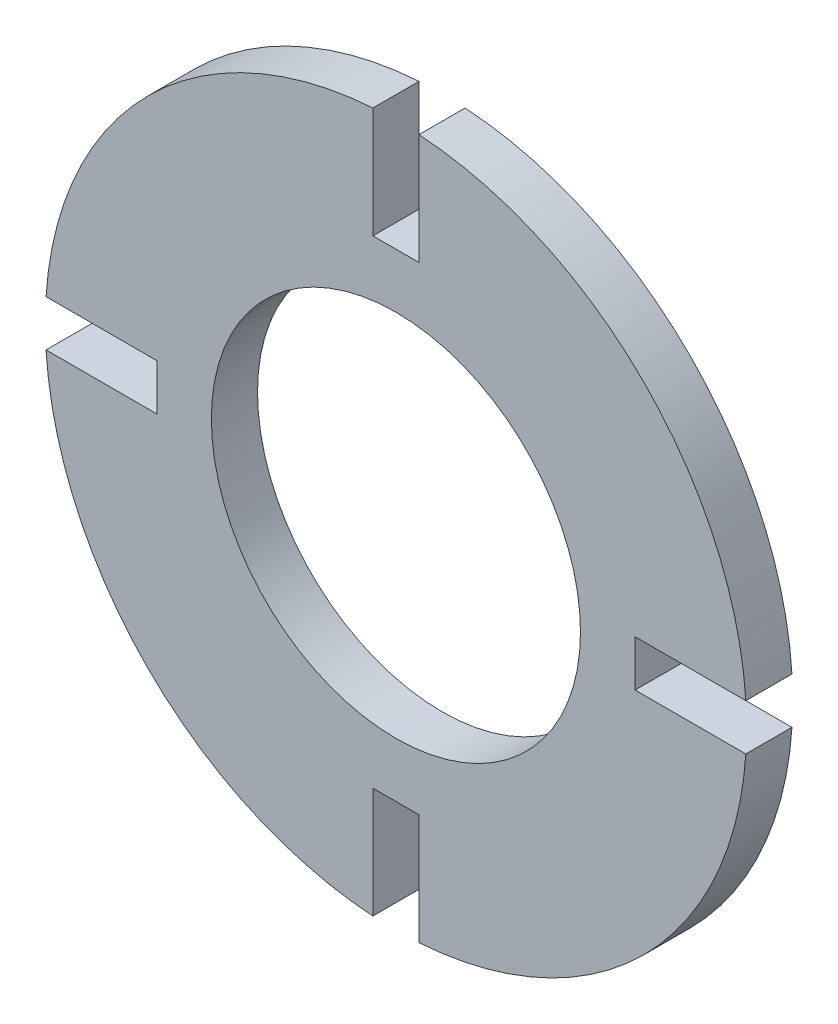
ISO-10303-21;
HEADER;
FILE_DESCRIPTION(('STEP AP214'),'2;1');
FILE_NAME('part.step','',(''),(''),'','','');
FILE_SCHEMA(('AUTOMOTIVE_DESIGN { 1 0 10303 214 1 1 1 1 }'));
ENDSEC;
DATA;
#1=APPLICATION_CONTEXT('core data for automotive mechanical design processes');
#2=APPLICATION_PROTOCOL_DEFINITION('international standard','automotive_design',2000,#1);
#3=PRODUCT_CONTEXT('',#1,'mechanical');
#4=PRODUCT('Part','Part','',(#3));
#5=PRODUCT_RELATED_PRODUCT_CATEGORY('part','',(#4));
#6=PRODUCT_DEFINITION_FORMATION('','',#4);
#7=PRODUCT_DEFINITION_CONTEXT('part definition',#1,'design');
#8=PRODUCT_DEFINITION('design','',#6,#7);
#9=PRODUCT_DEFINITION_SHAPE('','',#8);
#10=(LENGTH_UNIT() NAMED_UNIT(*) SI_UNIT(.MILLI.,.METRE.));
#11=(NAMED_UNIT(*) PLANE_ANGLE_UNIT() SI_UNIT($,.RADIAN.));
#12=(NAMED_UNIT(*) SI_UNIT($,.STERADIAN.) SOLID_ANGLE_UNIT());
#13=UNCERTAINTY_MEASURE_WITH_UNIT(LENGTH_MEASURE(1.E-05),#10,'distance_accuracy_value','');
#14=(GEOMETRIC_REPRESENTATION_CONTEXT(3) GLOBAL_UNCERTAINTY_ASSIGNED_CONTEXT((#13)) GLOBAL_UNIT_ASSIGNED_CONTEXT((#10,
#11,#12)) REPRESENTATION_CONTEXT('',''));
#15=CARTESIAN_POINT('',(0.,0.,0.));
#16=DIRECTION('',(0.,0.,1.));
#17=DIRECTION('',(1.,0.,0.));
#18=AXIS2_PLACEMENT_3D('',#15,#16,#17);
#19=CARTESIAN_POINT('',(0.,0.,5.));
#20=DIRECTION('',(0.,0.,1.));
#21=DIRECTION('',(1.,0.,0.));
#22=AXIS2_PLACEMENT_3D('',#19,#20,#21);
#23=PLANE('',#22);
#24=DIRECTION('',(-1.,0.,0.));
#25=VECTOR('',#24,1.);
#26=CARTESIAN_POINT('',(2.5,25.9176739792936,5.));
#27=LINE('',#26,#25);
#28=CARTESIAN_POINT('',(2.5,25.9176739792936,5.));
#29=VERTEX_POINT('',#28);
#30=CARTESIAN_POINT('',(-2.5,25.9176739792936,5.));
#31=VERTEX_POINT('',#30);
#32=EDGE_CURVE('E215',#29,#31,#27,.T.);
#33=ORIENTED_EDGE('',*,*,#32,.T.);
#34=DIRECTION('',(0.,1.,0.));
#35=VECTOR('',#34,1.);
#36=CARTESIAN_POINT('',(-2.5,25.9176739792936,5.));
#37=LINE('',#36,#35);
#38=CARTESIAN_POINT('',(-2.5,37.9176739792936,5.));
#39=VERTEX_POINT('',#38);
#40=EDGE_CURVE('E123',#31,#39,#37,.T.);
#41=ORIENTED_EDGE('',*,*,#40,.T.);
#42=CARTESIAN_POINT('',(0.,0.,5.));
#43=DIRECTION('',(0.,0.,1.));
#44=DIRECTION('',(1.,0.,0.));
#45=AXIS2_PLACEMENT_3D('',#42,#43,#44);
#46=CIRCLE('',#45,38.);
#47=CARTESIAN_POINT('',(-37.9176739792936,2.49999999999999,5.));
#48=VERTEX_POINT('',#47);
#49=EDGE_CURVE('E254',#39,#48,#46,.T.);
#50=ORIENTED_EDGE('',*,*,#49,.T.);
#51=DIRECTION('',(1.,0.,0.));
#52=VECTOR('',#51,1.);
#53=CARTESIAN_POINT('',(-37.9176739792936,2.49999999999999,5.));
#54=LINE('',#53,#52);
#55=CARTESIAN_POINT('',(-25.9176739792936,2.5,5.));
#56=VERTEX_POINT('',#55);
#57=EDGE_CURVE('E273',#48,#56,#54,.T.);
#58=ORIENTED_EDGE('',*,*,#57,.T.);
#59=DIRECTION('',(0.,-1.,0.));
#60=VECTOR('',#59,1.);
#61=CARTESIAN_POINT('',(-25.9176739792936,2.5,5.));
#62=LINE('',#61,#60);
#63=CARTESIAN_POINT('',(-25.9176739792936,-2.5,5.));
#64=VERTEX_POINT('',#63);
#65=EDGE_CURVE('E270',#56,#64,#62,.T.);
#66=ORIENTED_EDGE('',*,*,#65,.T.);
#67=DIRECTION('',(-1.,0.,0.));
#68=VECTOR('',#67,1.);
#69=CARTESIAN_POINT('',(-25.9176739792936,-2.5,5.));
#70=LINE('',#69,#68);
#71=CARTESIAN_POINT('',(-37.9176739792936,-2.5,5.));
#72=VERTEX_POINT('',#71);
#73=EDGE_CURVE('E272',#64,#72,#70,.T.);
#74=ORIENTED_EDGE('',*,*,#73,.T.);
#75=CARTESIAN_POINT('',(0.,0.,5.));
#76=DIRECTION('',(0.,0.,1.));
#77=DIRECTION('',(1.,0.,0.));
#78=AXIS2_PLACEMENT_3D('',#75,#76,#77);
#79=CIRCLE('',#78,38.);
#80=CARTESIAN_POINT('',(-2.5,-37.9176739792936,5.));
#81=VERTEX_POINT('',#80);
#82=EDGE_CURVE('E275',#72,#81,#79,.T.);
#83=ORIENTED_EDGE('',*,*,#82,.T.);
#84=DIRECTION('',(0.,1.,0.));
#85=VECTOR('',#84,1.);
#86=CARTESIAN_POINT('',(-2.5,-37.9176739792936,5.));
#87=LINE('',#86,#85);
#88=CARTESIAN_POINT('',(-2.5,-25.9176739792936,5.));
#89=VERTEX_POINT('',#88);
#90=EDGE_CURVE('E281',#81,#89,#87,.T.);
#91=ORIENTED_EDGE('',*,*,#90,.T.);
#92=DIRECTION('',(1.,0.,0.));
#93=VECTOR('',#92,1.);
#94=CARTESIAN_POINT('',(-2.5,-25.9176739792936,5.));
#95=LINE('',#94,#93);
#96=CARTESIAN_POINT('',(2.5,-25.9176739792936,5.));
#97=VERTEX_POINT('',#96);
#98=EDGE_CURVE('E283',#89,#97,#95,.T.);
#99=ORIENTED_EDGE('',*,*,#98,.T.);
#100=DIRECTION('',(0.,-1.,0.));
#101=VECTOR('',#100,1.);
#102=CARTESIAN_POINT('',(2.5,-25.9176739792936,5.));
#103=LINE('',#102,#101);
#104=CARTESIAN_POINT('',(2.5,-37.9176739792936,5.));
#105=VERTEX_POINT('',#104);
#106=EDGE_CURVE('E285',#97,#105,#103,.T.);
#107=ORIENTED_EDGE('',*,*,#106,.T.);
#108=CARTESIAN_POINT('',(0.,0.,5.));
#109=DIRECTION('',(0.,0.,1.));
#110=DIRECTION('',(1.,0.,0.));
#111=AXIS2_PLACEMENT_3D('',#108,#109,#110);
#112=CIRCLE('',#111,38.);
#113=CARTESIAN_POINT('',(37.9176739792936,-2.5,5.));
#114=VERTEX_POINT('',#113);
#115=EDGE_CURVE('E287',#105,#114,#112,.T.);
#116=ORIENTED_EDGE('',*,*,#115,.T.);
#117=DIRECTION('',(-1.,0.,0.));
#118=VECTOR('',#117,1.);
#119=CARTESIAN_POINT('',(37.9176739792936,-2.5,5.));
#120=LINE('',#119,#118);
#121=CARTESIAN_POINT('',(25.9176739792936,-2.5,5.));
#122=VERTEX_POINT('',#121);
#123=EDGE_CURVE('E289',#114,#122,#120,.T.);
#124=ORIENTED_EDGE('',*,*,#123,.T.);
#125=DIRECTION('',(0.,1.,0.));
#126=VECTOR('',#125,1.);
#127=CARTESIAN_POINT('',(25.9176739792936,-2.5,5.));
#128=LINE('',#127,#126);
#129=CARTESIAN_POINT('',(25.9176739792936,2.5,5.));
#130=VERTEX_POINT('',#129);
#131=EDGE_CURVE('E166',#122,#130,#128,.T.);
#132=ORIENTED_EDGE('',*,*,#131,.T.);
#133=DIRECTION('',(1.,0.,0.));
#134=VECTOR('',#133,1.);
#135=CARTESIAN_POINT('',(25.9176739792936,2.5,5.));
#136=LINE('',#135,#134);
#137=CARTESIAN_POINT('',(37.9176739792936,2.5,5.));
#138=VERTEX_POINT('',#137);
#139=EDGE_CURVE('E160',#130,#138,#136,.T.);
#140=ORIENTED_EDGE('',*,*,#139,.T.);
#141=CARTESIAN_POINT('',(0.,0.,5.));
#142=DIRECTION('',(0.,0.,1.));
#143=DIRECTION('',(1.,0.,0.));
#144=AXIS2_PLACEMENT_3D('',#141,#142,#143);
#145=CIRCLE('',#144,38.);
#146=CARTESIAN_POINT('',(2.5,37.9176739792936,5.));
#147=VERTEX_POINT('',#146);
#148=EDGE_CURVE('E164',#138,#147,#145,.T.);
#149=ORIENTED_EDGE('',*,*,#148,.T.);
#150=DIRECTION('',(0.,-1.,0.));
#151=VECTOR('',#150,1.);
#152=CARTESIAN_POINT('',(2.5,37.9176739792936,5.));
#153=LINE('',#152,#151);
#154=EDGE_CURVE('E56',#147,#29,#153,.T.);
#155=ORIENTED_EDGE('',*,*,#154,.T.);
#156=EDGE_LOOP('',(#33,#41,#50,#58,#66,#74,#83,#91,#99,#107,#116,#124,#132,#140,#149,#155));
#157=FACE_BOUND('',#156,.T.);
#158=CARTESIAN_POINT('',(0.,0.,5.));
#159=DIRECTION('',(0.,0.,1.));
#160=DIRECTION('',(1.,0.,0.));
#161=AXIS2_PLACEMENT_3D('',#158,#159,#160);
#162=CIRCLE('',#161,20.);
#163=CARTESIAN_POINT('',(20.,0.,5.));
#164=VERTEX_POINT('',#163);
#165=EDGE_CURVE('E188',#164,#164,#162,.T.);
#166=ORIENTED_EDGE('',*,*,#165,.F.);
#167=EDGE_LOOP('',(#166));
#168=FACE_BOUND('',#167,.T.);
#169=ADVANCED_FACE('F39',(#157,#168),#23,.T.);
#170=CARTESIAN_POINT('',(0.,0.,0.));
#171=DIRECTION('',(0.,0.,1.));
#172=DIRECTION('',(1.,0.,0.));
#173=AXIS2_PLACEMENT_3D('',#170,#171,#172);
#174=PLANE('',#173);
#175=DIRECTION('',(-1.,0.,0.));
#176=VECTOR('',#175,1.);
#177=CARTESIAN_POINT('',(2.5,25.9176739792936,0.));
#178=LINE('',#177,#176);
#179=CARTESIAN_POINT('',(2.5,25.9176739792936,0.));
#180=VERTEX_POINT('',#179);
#181=CARTESIAN_POINT('',(-2.5,25.9176739792936,0.));
#182=VERTEX_POINT('',#181);
#183=EDGE_CURVE('E184',#180,#182,#178,.T.);
#184=ORIENTED_EDGE('',*,*,#183,.F.);
#185=DIRECTION('',(0.,-1.,0.));
#186=VECTOR('',#185,1.);
#187=CARTESIAN_POINT('',(2.5,37.9176739792936,0.));
#188=LINE('',#187,#186);
#189=CARTESIAN_POINT('',(2.5,37.9176739792936,0.));
#190=VERTEX_POINT('',#189);
#191=EDGE_CURVE('E115',#190,#180,#188,.T.);
#192=ORIENTED_EDGE('',*,*,#191,.F.);
#193=CARTESIAN_POINT('',(0.,0.,0.));
#194=DIRECTION('',(0.,0.,1.));
#195=DIRECTION('',(1.,0.,0.));
#196=AXIS2_PLACEMENT_3D('',#193,#194,#195);
#197=CIRCLE('',#196,38.);
#198=CARTESIAN_POINT('',(37.9176739792936,2.5,0.));
#199=VERTEX_POINT('',#198);
#200=EDGE_CURVE('E109',#199,#190,#197,.T.);
#201=ORIENTED_EDGE('',*,*,#200,.F.);
#202=DIRECTION('',(1.,0.,0.));
#203=VECTOR('',#202,1.);
#204=CARTESIAN_POINT('',(25.9176739792936,2.5,0.));
#205=LINE('',#204,#203);
#206=CARTESIAN_POINT('',(25.9176739792936,2.5,0.));
#207=VERTEX_POINT('',#206);
#208=EDGE_CURVE('E174',#207,#199,#205,.T.);
#209=ORIENTED_EDGE('',*,*,#208,.F.);
#210=DIRECTION('',(0.,1.,0.));
#211=VECTOR('',#210,1.);
#212=CARTESIAN_POINT('',(25.9176739792936,-2.5,0.));
#213=LINE('',#212,#211);
#214=CARTESIAN_POINT('',(25.9176739792936,-2.5,0.));
#215=VERTEX_POINT('',#214);
#216=EDGE_CURVE('E210',#215,#207,#213,.T.);
#217=ORIENTED_EDGE('',*,*,#216,.F.);
#218=DIRECTION('',(-1.,0.,0.));
#219=VECTOR('',#218,1.);
#220=CARTESIAN_POINT('',(37.9176739792936,-2.5,0.));
#221=LINE('',#220,#219);
#222=CARTESIAN_POINT('',(37.9176739792936,-2.5,0.));
#223=VERTEX_POINT('',#222);
#224=EDGE_CURVE('E208',#223,#215,#221,.T.);
#225=ORIENTED_EDGE('',*,*,#224,.F.);
#226=CARTESIAN_POINT('',(0.,0.,0.));
#227=DIRECTION('',(0.,0.,1.));
#228=DIRECTION('',(1.,0.,0.));
#229=AXIS2_PLACEMENT_3D('',#226,#227,#228);
#230=CIRCLE('',#229,38.);
#231=CARTESIAN_POINT('',(2.5,-37.9176739792936,0.));
#232=VERTEX_POINT('',#231);
#233=EDGE_CURVE('E206',#232,#223,#230,.T.);
#234=ORIENTED_EDGE('',*,*,#233,.F.);
#235=DIRECTION('',(0.,-1.,0.));
#236=VECTOR('',#235,1.);
#237=CARTESIAN_POINT('',(2.5,-25.9176739792936,0.));
#238=LINE('',#237,#236);
#239=CARTESIAN_POINT('',(2.5,-25.9176739792936,0.));
#240=VERTEX_POINT('',#239);
#241=EDGE_CURVE('E204',#240,#232,#238,.T.);
#242=ORIENTED_EDGE('',*,*,#241,.F.);
#243=DIRECTION('',(1.,0.,0.));
#244=VECTOR('',#243,1.);
#245=CARTESIAN_POINT('',(-2.5,-25.9176739792936,0.));
#246=LINE('',#245,#244);
#247=CARTESIAN_POINT('',(-2.5,-25.9176739792936,0.));
#248=VERTEX_POINT('',#247);
#249=EDGE_CURVE('E202',#248,#240,#246,.T.);
#250=ORIENTED_EDGE('',*,*,#249,.F.);
#251=DIRECTION('',(0.,1.,0.));
#252=VECTOR('',#251,1.);
#253=CARTESIAN_POINT('',(-2.5,-37.9176739792936,0.));
#254=LINE('',#253,#252);
#255=CARTESIAN_POINT('',(-2.5,-37.9176739792936,0.));
#256=VERTEX_POINT('',#255);
#257=EDGE_CURVE('E200',#256,#248,#254,.T.);
#258=ORIENTED_EDGE('',*,*,#257,.F.);
#259=CARTESIAN_POINT('',(0.,0.,0.));
#260=DIRECTION('',(0.,0.,1.));
#261=DIRECTION('',(1.,0.,0.));
#262=AXIS2_PLACEMENT_3D('',#259,#260,#261);
#263=CIRCLE('',#262,38.);
#264=CARTESIAN_POINT('',(-37.9176739792936,-2.5,0.));
#265=VERTEX_POINT('',#264);
#266=EDGE_CURVE('E198',#265,#256,#263,.T.);
#267=ORIENTED_EDGE('',*,*,#266,.F.);
#268=DIRECTION('',(-1.,0.,0.));
#269=VECTOR('',#268,1.);
#270=CARTESIAN_POINT('',(-25.9176739792936,-2.5,0.));
#271=LINE('',#270,#269);
#272=CARTESIAN_POINT('',(-25.9176739792936,-2.5,0.));
#273=VERTEX_POINT('',#272);
#274=EDGE_CURVE('E196',#273,#265,#271,.T.);
#275=ORIENTED_EDGE('',*,*,#274,.F.);
#276=DIRECTION('',(0.,-1.,0.));
#277=VECTOR('',#276,1.);
#278=CARTESIAN_POINT('',(-25.9176739792936,2.5,0.));
#279=LINE('',#278,#277);
#280=CARTESIAN_POINT('',(-25.9176739792936,2.5,0.));
#281=VERTEX_POINT('',#280);
#282=EDGE_CURVE('E194',#281,#273,#279,.T.);
#283=ORIENTED_EDGE('',*,*,#282,.F.);
#284=DIRECTION('',(1.,0.,0.));
#285=VECTOR('',#284,1.);
#286=CARTESIAN_POINT('',(-37.9176739792936,2.49999999999999,0.));
#287=LINE('',#286,#285);
#288=CARTESIAN_POINT('',(-37.9176739792936,2.49999999999999,0.));
#289=VERTEX_POINT('',#288);
#290=EDGE_CURVE('E192',#289,#281,#287,.T.);
#291=ORIENTED_EDGE('',*,*,#290,.F.);
#292=CARTESIAN_POINT('',(0.,0.,0.));
#293=DIRECTION('',(0.,0.,1.));
#294=DIRECTION('',(1.,0.,0.));
#295=AXIS2_PLACEMENT_3D('',#292,#293,#294);
#296=CIRCLE('',#295,38.);
#297=CARTESIAN_POINT('',(-2.5,37.9176739792936,0.));
#298=VERTEX_POINT('',#297);
#299=EDGE_CURVE('E190',#298,#289,#296,.T.);
#300=ORIENTED_EDGE('',*,*,#299,.F.);
#301=DIRECTION('',(0.,1.,0.));
#302=VECTOR('',#301,1.);
#303=CARTESIAN_POINT('',(-2.5,25.9176739792936,0.));
#304=LINE('',#303,#302);
#305=EDGE_CURVE('E187',#182,#298,#304,.T.);
#306=ORIENTED_EDGE('',*,*,#305,.F.);
#307=EDGE_LOOP('',(#184,#192,#201,#209,#217,#225,#234,#242,#250,#258,#267,#275,#283,#291,#300,#306));
#308=FACE_BOUND('',#307,.T.);
#309=CARTESIAN_POINT('',(0.,0.,0.));
#310=DIRECTION('',(0.,0.,1.));
#311=DIRECTION('',(1.,0.,0.));
#312=AXIS2_PLACEMENT_3D('',#309,#310,#311);
#313=CIRCLE('',#312,20.);
#314=CARTESIAN_POINT('',(20.,0.,0.));
#315=VERTEX_POINT('',#314);
#316=EDGE_CURVE('E488',#315,#315,#313,.T.);
#317=ORIENTED_EDGE('',*,*,#316,.T.);
#318=EDGE_LOOP('',(#317));
#319=FACE_BOUND('',#318,.T.);
#320=ADVANCED_FACE('F258',(#308,#319),#174,.F.);
#321=CARTESIAN_POINT('',(2.5,25.9176739792936,5.));
#322=DIRECTION('',(0.,-1.,0.));
#323=DIRECTION('',(0.,0.,-1.));
#324=AXIS2_PLACEMENT_3D('',#321,#322,#323);
#325=PLANE('',#324);
#326=ORIENTED_EDGE('',*,*,#183,.T.);
#327=DIRECTION('',(0.,0.,-1.));
#328=VECTOR('',#327,1.);
#329=CARTESIAN_POINT('',(-2.5,25.9176739792936,5.));
#330=LINE('',#329,#328);
#331=EDGE_CURVE('E11',#31,#182,#330,.T.);
#332=ORIENTED_EDGE('',*,*,#331,.F.);
#333=ORIENTED_EDGE('',*,*,#32,.F.);
#334=DIRECTION('',(0.,0.,-1.));
#335=VECTOR('',#334,1.);
#336=CARTESIAN_POINT('',(2.5,25.9176739792936,5.));
#337=LINE('',#336,#335);
#338=EDGE_CURVE('E180',#29,#180,#337,.T.);
#339=ORIENTED_EDGE('',*,*,#338,.T.);
#340=EDGE_LOOP('',(#326,#332,#333,#339));
#341=FACE_BOUND('',#340,.T.);
#342=ADVANCED_FACE('F41',(#341),#325,.F.);
#343=CARTESIAN_POINT('',(-2.5,25.9176739792936,5.));
#344=DIRECTION('',(-1.,0.,0.));
#345=DIRECTION('',(0.,0.,1.));
#346=AXIS2_PLACEMENT_3D('',#343,#344,#345);
#347=PLANE('',#346);
#348=ORIENTED_EDGE('',*,*,#305,.T.);
#349=DIRECTION('',(0.,0.,-1.));
#350=VECTOR('',#349,1.);
#351=CARTESIAN_POINT('',(-2.5,37.9176739792936,5.));
#352=LINE('',#351,#350);
#353=EDGE_CURVE('E48',#39,#298,#352,.T.);
#354=ORIENTED_EDGE('',*,*,#353,.F.);
#355=ORIENTED_EDGE('',*,*,#40,.F.);
#356=ORIENTED_EDGE('',*,*,#331,.T.);
#357=EDGE_LOOP('',(#348,#354,#355,#356));
#358=FACE_BOUND('',#357,.T.);
#359=ADVANCED_FACE('F323',(#358),#347,.F.);
#360=CARTESIAN_POINT('',(0.,0.,5.));
#361=DIRECTION('',(0.,0.,-1.));
#362=DIRECTION('',(-1.,0.,0.));
#363=AXIS2_PLACEMENT_3D('',#360,#361,#362);
#364=CYLINDRICAL_SURFACE('',#363,38.);
#365=ORIENTED_EDGE('',*,*,#299,.T.);
#366=DIRECTION('',(0.,0.,-1.));
#367=VECTOR('',#366,1.);
#368=CARTESIAN_POINT('',(-37.9176739792936,2.49999999999999,5.));
#369=LINE('',#368,#367);
#370=EDGE_CURVE('E246',#48,#289,#369,.T.);
#371=ORIENTED_EDGE('',*,*,#370,.F.);
#372=ORIENTED_EDGE('',*,*,#49,.F.);
#373=ORIENTED_EDGE('',*,*,#353,.T.);
#374=EDGE_LOOP('',(#365,#371,#372,#373));
#375=FACE_BOUND('',#374,.T.);
#376=ADVANCED_FACE('F252',(#375),#364,.T.);
#377=CARTESIAN_POINT('',(-37.9176739792936,2.49999999999999,5.));
#378=DIRECTION('',(0.,1.,0.));
#379=DIRECTION('',(-1.,0.,0.));
#380=AXIS2_PLACEMENT_3D('',#377,#378,#379);
#381=PLANE('',#380);
#382=ORIENTED_EDGE('',*,*,#290,.T.);
#383=DIRECTION('',(0.,0.,-1.));
#384=VECTOR('',#383,1.);
#385=CARTESIAN_POINT('',(-25.9176739792936,2.5,5.));
#386=LINE('',#385,#384);
#387=EDGE_CURVE('E243',#56,#281,#386,.T.);
#388=ORIENTED_EDGE('',*,*,#387,.F.);
#389=ORIENTED_EDGE('',*,*,#57,.F.);
#390=ORIENTED_EDGE('',*,*,#370,.T.);
#391=EDGE_LOOP('',(#382,#388,#389,#390));
#392=FACE_BOUND('',#391,.T.);
#393=ADVANCED_FACE('F264',(#392),#381,.F.);
#394=CARTESIAN_POINT('',(-25.9176739792936,2.5,5.));
#395=DIRECTION('',(1.,0.,0.));
#396=DIRECTION('',(0.,0.,-1.));
#397=AXIS2_PLACEMENT_3D('',#394,#395,#396);
#398=PLANE('',#397);
#399=ORIENTED_EDGE('',*,*,#282,.T.);
#400=DIRECTION('',(0.,0.,-1.));
#401=VECTOR('',#400,1.);
#402=CARTESIAN_POINT('',(-25.9176739792936,-2.5,5.));
#403=LINE('',#402,#401);
#404=EDGE_CURVE('E240',#64,#273,#403,.T.);
#405=ORIENTED_EDGE('',*,*,#404,.F.);
#406=ORIENTED_EDGE('',*,*,#65,.F.);
#407=ORIENTED_EDGE('',*,*,#387,.T.);
#408=EDGE_LOOP('',(#399,#405,#406,#407));
#409=FACE_BOUND('',#408,.T.);
#410=ADVANCED_FACE('F268',(#409),#398,.F.);
#411=CARTESIAN_POINT('',(-25.9176739792936,-2.5,5.));
#412=DIRECTION('',(0.,-1.,0.));
#413=DIRECTION('',(1.,0.,0.));
#414=AXIS2_PLACEMENT_3D('',#411,#412,#413);
#415=PLANE('',#414);
#416=ORIENTED_EDGE('',*,*,#274,.T.);
#417=DIRECTION('',(0.,0.,-1.));
#418=VECTOR('',#417,1.);
#419=CARTESIAN_POINT('',(-37.9176739792936,-2.5,5.));
#420=LINE('',#419,#418);
#421=EDGE_CURVE('E237',#72,#265,#420,.T.);
#422=ORIENTED_EDGE('',*,*,#421,.F.);
#423=ORIENTED_EDGE('',*,*,#73,.F.);
#424=ORIENTED_EDGE('',*,*,#404,.T.);
#425=EDGE_LOOP('',(#416,#422,#423,#424));
#426=FACE_BOUND('',#425,.T.);
#427=ADVANCED_FACE('F336',(#426),#415,.F.);
#428=CARTESIAN_POINT('',(0.,0.,5.));
#429=DIRECTION('',(0.,0.,-1.));
#430=DIRECTION('',(-1.,0.,0.));
#431=AXIS2_PLACEMENT_3D('',#428,#429,#430);
#432=CYLINDRICAL_SURFACE('',#431,38.);
#433=ORIENTED_EDGE('',*,*,#266,.T.);
#434=DIRECTION('',(0.,0.,-1.));
#435=VECTOR('',#434,1.);
#436=CARTESIAN_POINT('',(-2.5,-37.9176739792936,5.));
#437=LINE('',#436,#435);
#438=EDGE_CURVE('E234',#81,#256,#437,.T.);
#439=ORIENTED_EDGE('',*,*,#438,.F.);
#440=ORIENTED_EDGE('',*,*,#82,.F.);
#441=ORIENTED_EDGE('',*,*,#421,.T.);
#442=EDGE_LOOP('',(#433,#439,#440,#441));
#443=FACE_BOUND('',#442,.T.);
#444=ADVANCED_FACE('F339',(#443),#432,.T.);
#445=CARTESIAN_POINT('',(-2.5,-37.9176739792936,5.));
#446=DIRECTION('',(-1.,0.,0.));
#447=DIRECTION('',(0.,-1.,0.));
#448=AXIS2_PLACEMENT_3D('',#445,#446,#447);
#449=PLANE('',#448);
#450=ORIENTED_EDGE('',*,*,#257,.T.);
#451=DIRECTION('',(0.,0.,-1.));
#452=VECTOR('',#451,1.);
#453=CARTESIAN_POINT('',(-2.5,-25.9176739792936,5.));
#454=LINE('',#453,#452);
#455=EDGE_CURVE('E231',#89,#248,#454,.T.);
#456=ORIENTED_EDGE('',*,*,#455,.F.);
#457=ORIENTED_EDGE('',*,*,#90,.F.);
#458=ORIENTED_EDGE('',*,*,#438,.T.);
#459=EDGE_LOOP('',(#450,#456,#457,#458));
#460=FACE_BOUND('',#459,.T.);
#461=ADVANCED_FACE('F343',(#460),#449,.F.);
#462=CARTESIAN_POINT('',(-2.5,-25.9176739792936,5.));
#463=DIRECTION('',(0.,1.,0.));
#464=DIRECTION('',(0.,0.,1.));
#465=AXIS2_PLACEMENT_3D('',#462,#463,#464);
#466=PLANE('',#465);
#467=ORIENTED_EDGE('',*,*,#249,.T.);
#468=DIRECTION('',(0.,0.,-1.));
#469=VECTOR('',#468,1.);
#470=CARTESIAN_POINT('',(2.5,-25.9176739792936,5.));
#471=LINE('',#470,#469);
#472=EDGE_CURVE('E228',#97,#240,#471,.T.);
#473=ORIENTED_EDGE('',*,*,#472,.F.);
#474=ORIENTED_EDGE('',*,*,#98,.F.);
#475=ORIENTED_EDGE('',*,*,#455,.T.);
#476=EDGE_LOOP('',(#467,#473,#474,#475));
#477=FACE_BOUND('',#476,.T.);
#478=ADVANCED_FACE('F347',(#477),#466,.F.);
#479=CARTESIAN_POINT('',(2.5,-25.9176739792936,5.));
#480=DIRECTION('',(1.,0.,0.));
#481=DIRECTION('',(0.,1.,0.));
#482=AXIS2_PLACEMENT_3D('',#479,#480,#481);
#483=PLANE('',#482);
#484=ORIENTED_EDGE('',*,*,#241,.T.);
#485=DIRECTION('',(0.,0.,-1.));
#486=VECTOR('',#485,1.);
#487=CARTESIAN_POINT('',(2.5,-37.9176739792936,5.));
#488=LINE('',#487,#486);
#489=EDGE_CURVE('E225',#105,#232,#488,.T.);
#490=ORIENTED_EDGE('',*,*,#489,.F.);
#491=ORIENTED_EDGE('',*,*,#106,.F.);
#492=ORIENTED_EDGE('',*,*,#472,.T.);
#493=EDGE_LOOP('',(#484,#490,#491,#492));
#494=FACE_BOUND('',#493,.T.);
#495=ADVANCED_FACE('F351',(#494),#483,.F.);
#496=CARTESIAN_POINT('',(0.,0.,5.));
#497=DIRECTION('',(0.,0.,-1.));
#498=DIRECTION('',(-1.,0.,0.));
#499=AXIS2_PLACEMENT_3D('',#496,#497,#498);
#500=CYLINDRICAL_SURFACE('',#499,38.);
#501=ORIENTED_EDGE('',*,*,#233,.T.);
#502=DIRECTION('',(0.,0.,-1.));
#503=VECTOR('',#502,1.);
#504=CARTESIAN_POINT('',(37.9176739792936,-2.5,5.));
#505=LINE('',#504,#503);
#506=EDGE_CURVE('E222',#114,#223,#505,.T.);
#507=ORIENTED_EDGE('',*,*,#506,.F.);
#508=ORIENTED_EDGE('',*,*,#115,.F.);
#509=ORIENTED_EDGE('',*,*,#489,.T.);
#510=EDGE_LOOP('',(#501,#507,#508,#509));
#511=FACE_BOUND('',#510,.T.);
#512=ADVANCED_FACE('F355',(#511),#500,.T.);
#513=CARTESIAN_POINT('',(37.9176739792936,-2.5,5.));
#514=DIRECTION('',(0.,-1.,0.));
#515=DIRECTION('',(1.,0.,0.));
#516=AXIS2_PLACEMENT_3D('',#513,#514,#515);
#517=PLANE('',#516);
#518=ORIENTED_EDGE('',*,*,#224,.T.);
#519=DIRECTION('',(0.,0.,-1.));
#520=VECTOR('',#519,1.);
#521=CARTESIAN_POINT('',(25.9176739792936,-2.5,5.));
#522=LINE('',#521,#520);
#523=EDGE_CURVE('E219',#122,#215,#522,.T.);
#524=ORIENTED_EDGE('',*,*,#523,.F.);
#525=ORIENTED_EDGE('',*,*,#123,.F.);
#526=ORIENTED_EDGE('',*,*,#506,.T.);
#527=EDGE_LOOP('',(#518,#524,#525,#526));
#528=FACE_BOUND('',#527,.T.);
#529=ADVANCED_FACE('F295',(#528),#517,.F.);
#530=CARTESIAN_POINT('',(25.9176739792936,-2.5,5.));
#531=DIRECTION('',(-1.,0.,0.));
#532=DIRECTION('',(0.,0.,1.));
#533=AXIS2_PLACEMENT_3D('',#530,#531,#532);
#534=PLANE('',#533);
#535=ORIENTED_EDGE('',*,*,#216,.T.);
#536=DIRECTION('',(0.,0.,-1.));
#537=VECTOR('',#536,1.);
#538=CARTESIAN_POINT('',(25.9176739792936,2.5,5.));
#539=LINE('',#538,#537);
#540=EDGE_CURVE('E175',#130,#207,#539,.T.);
#541=ORIENTED_EDGE('',*,*,#540,.F.);
#542=ORIENTED_EDGE('',*,*,#131,.F.);
#543=ORIENTED_EDGE('',*,*,#523,.T.);
#544=EDGE_LOOP('',(#535,#541,#542,#543));
#545=FACE_BOUND('',#544,.T.);
#546=ADVANCED_FACE('F299',(#545),#534,.F.);
#547=CARTESIAN_POINT('',(25.9176739792936,2.5,5.));
#548=DIRECTION('',(0.,1.,0.));
#549=DIRECTION('',(-1.,0.,0.));
#550=AXIS2_PLACEMENT_3D('',#547,#548,#549);
#551=PLANE('',#550);
#552=ORIENTED_EDGE('',*,*,#208,.T.);
#553=DIRECTION('',(0.,0.,-1.));
#554=VECTOR('',#553,1.);
#555=CARTESIAN_POINT('',(37.9176739792936,2.5,5.));
#556=LINE('',#555,#554);
#557=EDGE_CURVE('E171',#138,#199,#556,.T.);
#558=ORIENTED_EDGE('',*,*,#557,.F.);
#559=ORIENTED_EDGE('',*,*,#139,.F.);
#560=ORIENTED_EDGE('',*,*,#540,.T.);
#561=EDGE_LOOP('',(#552,#558,#559,#560));
#562=FACE_BOUND('',#561,.T.);
#563=ADVANCED_FACE('F172',(#562),#551,.F.);
#564=CARTESIAN_POINT('',(0.,0.,5.));
#565=DIRECTION('',(0.,0.,-1.));
#566=DIRECTION('',(-1.,0.,0.));
#567=AXIS2_PLACEMENT_3D('',#564,#565,#566);
#568=CYLINDRICAL_SURFACE('',#567,38.);
#569=ORIENTED_EDGE('',*,*,#200,.T.);
#570=DIRECTION('',(0.,0.,-1.));
#571=VECTOR('',#570,1.);
#572=CARTESIAN_POINT('',(2.5,37.9176739792936,5.));
#573=LINE('',#572,#571);
#574=EDGE_CURVE('E176',#147,#190,#573,.T.);
#575=ORIENTED_EDGE('',*,*,#574,.F.);
#576=ORIENTED_EDGE('',*,*,#148,.F.);
#577=ORIENTED_EDGE('',*,*,#557,.T.);
#578=EDGE_LOOP('',(#569,#575,#576,#577));
#579=FACE_BOUND('',#578,.T.);
#580=ADVANCED_FACE('F178',(#579),#568,.T.);
#581=CARTESIAN_POINT('',(2.5,37.9176739792936,5.));
#582=DIRECTION('',(1.,0.,0.));
#583=DIRECTION('',(0.,0.,-1.));
#584=AXIS2_PLACEMENT_3D('',#581,#582,#583);
#585=PLANE('',#584);
#586=ORIENTED_EDGE('',*,*,#191,.T.);
#587=ORIENTED_EDGE('',*,*,#338,.F.);
#588=ORIENTED_EDGE('',*,*,#154,.F.);
#589=ORIENTED_EDGE('',*,*,#574,.T.);
#590=EDGE_LOOP('',(#586,#587,#588,#589));
#591=FACE_BOUND('',#590,.T.);
#592=ADVANCED_FACE('F303',(#591),#585,.F.);
#593=CARTESIAN_POINT('',(0.,0.,5.));
#594=DIRECTION('',(0.,0.,-1.));
#595=DIRECTION('',(-1.,0.,0.));
#596=AXIS2_PLACEMENT_3D('',#593,#594,#595);
#597=CYLINDRICAL_SURFACE('',#596,20.);
#598=ORIENTED_EDGE('',*,*,#165,.T.);
#599=EDGE_LOOP('',(#598));
#600=FACE_BOUND('',#599,.T.);
#601=ORIENTED_EDGE('',*,*,#316,.F.);
#602=EDGE_LOOP('',(#601));
#603=FACE_BOUND('',#602,.T.);
#604=ADVANCED_FACE('F305',(#600,#603),#597,.F.);
#605=CLOSED_SHELL('',(#169,#320,#342,#359,#376,#393,#410,#427,#444,#461,#478,#495,#512,#529,
#546,#563,#580,#592,#604));
#606=MANIFOLD_SOLID_BREP('B2',#605);
#607=ADVANCED_BREP_SHAPE_REPRESENTATION('',(#18,#606),#14);
#608=SHAPE_DEFINITION_REPRESENTATION(#9,#607);
ENDSEC;
END-ISO-10303-21;
